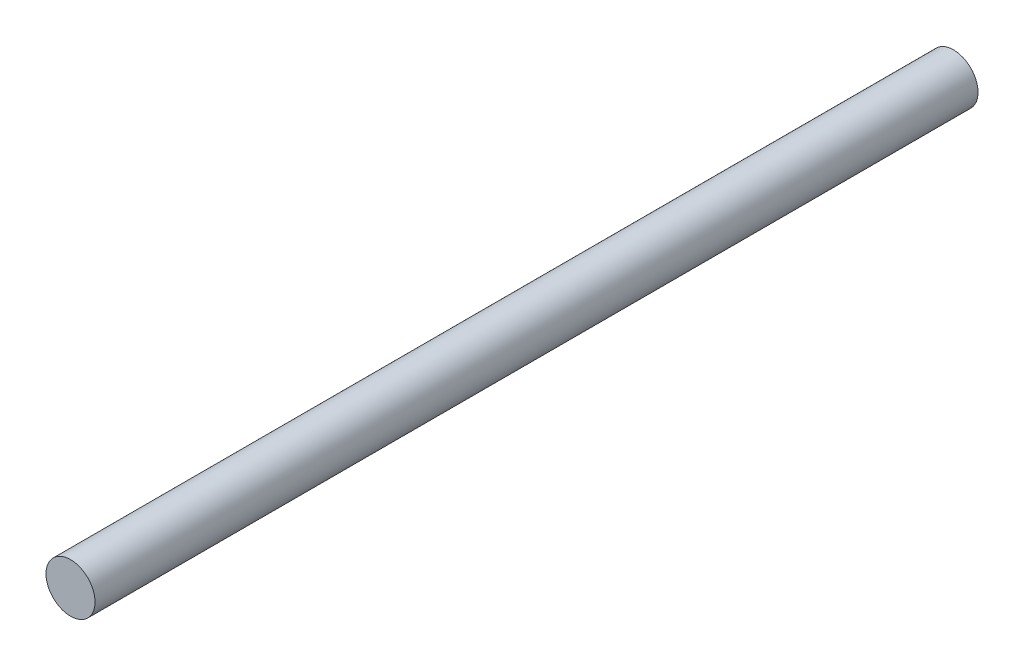
ISO-10303-21;
HEADER;
FILE_DESCRIPTION(('STEP AP214'),'2;1');
FILE_NAME('part.step','',(''),(''),'','','');
FILE_SCHEMA(('AUTOMOTIVE_DESIGN { 1 0 10303 214 1 1 1 1 }'));
ENDSEC;
DATA;
#1=APPLICATION_CONTEXT('core data for automotive mechanical design processes');
#2=APPLICATION_PROTOCOL_DEFINITION('international standard','automotive_design',2000,#1);
#3=PRODUCT_CONTEXT('',#1,'mechanical');
#4=PRODUCT('Part','Part','',(#3));
#5=PRODUCT_RELATED_PRODUCT_CATEGORY('part','',(#4));
#6=PRODUCT_DEFINITION_FORMATION('','',#4);
#7=PRODUCT_DEFINITION_CONTEXT('part definition',#1,'design');
#8=PRODUCT_DEFINITION('design','',#6,#7);
#9=PRODUCT_DEFINITION_SHAPE('','',#8);
#10=(LENGTH_UNIT() NAMED_UNIT(*) SI_UNIT(.MILLI.,.METRE.));
#11=(NAMED_UNIT(*) PLANE_ANGLE_UNIT() SI_UNIT($,.RADIAN.));
#12=(NAMED_UNIT(*) SI_UNIT($,.STERADIAN.) SOLID_ANGLE_UNIT());
#13=UNCERTAINTY_MEASURE_WITH_UNIT(LENGTH_MEASURE(1.E-05),#10,'distance_accuracy_value','');
#14=(GEOMETRIC_REPRESENTATION_CONTEXT(3) GLOBAL_UNCERTAINTY_ASSIGNED_CONTEXT((#13)) GLOBAL_UNIT_ASSIGNED_CONTEXT((#10,
#11,#12)) REPRESENTATION_CONTEXT('',''));
#15=CARTESIAN_POINT('',(0.,0.,0.));
#16=DIRECTION('',(0.,0.,1.));
#17=DIRECTION('',(1.,0.,0.));
#18=AXIS2_PLACEMENT_3D('',#15,#16,#17);
#19=CARTESIAN_POINT('',(0.,0.,180.));
#20=DIRECTION('',(0.,0.,-1.));
#21=DIRECTION('',(-1.,0.,0.));
#22=AXIS2_PLACEMENT_3D('',#19,#20,#21);
#23=CYLINDRICAL_SURFACE('',#22,5.);
#24=CARTESIAN_POINT('',(0.,0.,180.));
#25=DIRECTION('',(0.,0.,1.));
#26=DIRECTION('',(1.,0.,0.));
#27=AXIS2_PLACEMENT_3D('',#24,#25,#26);
#28=CIRCLE('',#27,5.);
#29=CARTESIAN_POINT('',(-5.,0.,180.));
#30=VERTEX_POINT('',#29);
#31=EDGE_CURVE('E12',#30,#30,#28,.T.);
#32=CARTESIAN_POINT('',(0.,0.,0.));
#33=DIRECTION('',(0.,0.,1.));
#34=DIRECTION('',(1.,0.,0.));
#35=AXIS2_PLACEMENT_3D('',#32,#33,#34);
#36=CIRCLE('',#35,5.);
#37=CARTESIAN_POINT('',(-5.,0.,0.));
#38=VERTEX_POINT('',#37);
#39=EDGE_CURVE('E43',#38,#38,#36,.T.);
#40=CARTESIAN_POINT('',(-5.,0.,180.));
#41=CARTESIAN_POINT('',(-5.,0.,178.125));
#42=CARTESIAN_POINT('',(-5.,0.,176.25));
#43=CARTESIAN_POINT('',(-5.,0.,172.5));
#44=CARTESIAN_POINT('',(-5.,0.,170.625));
#45=CARTESIAN_POINT('',(-5.,0.,166.875));
#46=CARTESIAN_POINT('',(-5.,0.,165.));
#47=CARTESIAN_POINT('',(-5.,0.,161.25));
#48=CARTESIAN_POINT('',(-5.,0.,159.375));
#49=CARTESIAN_POINT('',(-5.,0.,155.625));
#50=CARTESIAN_POINT('',(-5.,0.,153.75));
#51=CARTESIAN_POINT('',(-5.,0.,150.));
#52=CARTESIAN_POINT('',(-5.,0.,148.125));
#53=CARTESIAN_POINT('',(-5.,0.,144.375));
#54=CARTESIAN_POINT('',(-5.,0.,142.5));
#55=CARTESIAN_POINT('',(-5.,0.,138.75));
#56=CARTESIAN_POINT('',(-5.,0.,136.875));
#57=CARTESIAN_POINT('',(-5.,0.,133.125));
#58=CARTESIAN_POINT('',(-5.,0.,131.25));
#59=CARTESIAN_POINT('',(-5.,0.,127.5));
#60=CARTESIAN_POINT('',(-5.,0.,125.625));
#61=CARTESIAN_POINT('',(-5.,0.,121.875));
#62=CARTESIAN_POINT('',(-5.,0.,120.));
#63=CARTESIAN_POINT('',(-5.,0.,116.25));
#64=CARTESIAN_POINT('',(-5.,0.,114.375));
#65=CARTESIAN_POINT('',(-5.,0.,110.625));
#66=CARTESIAN_POINT('',(-5.,0.,108.75));
#67=CARTESIAN_POINT('',(-5.,0.,105.));
#68=CARTESIAN_POINT('',(-5.,0.,103.125));
#69=CARTESIAN_POINT('',(-5.,0.,99.375));
#70=CARTESIAN_POINT('',(-5.,0.,97.5));
#71=CARTESIAN_POINT('',(-5.,0.,93.75));
#72=CARTESIAN_POINT('',(-5.,0.,91.875));
#73=CARTESIAN_POINT('',(-5.,0.,88.125));
#74=CARTESIAN_POINT('',(-5.,0.,86.25));
#75=CARTESIAN_POINT('',(-5.,0.,82.5));
#76=CARTESIAN_POINT('',(-5.,0.,80.625));
#77=CARTESIAN_POINT('',(-5.,0.,76.875));
#78=CARTESIAN_POINT('',(-5.,0.,75.));
#79=CARTESIAN_POINT('',(-5.,0.,71.25));
#80=CARTESIAN_POINT('',(-5.,0.,69.375));
#81=CARTESIAN_POINT('',(-5.,0.,65.625));
#82=CARTESIAN_POINT('',(-5.,0.,63.75));
#83=CARTESIAN_POINT('',(-5.,0.,60.));
#84=CARTESIAN_POINT('',(-5.,0.,58.125));
#85=CARTESIAN_POINT('',(-5.,0.,54.375));
#86=CARTESIAN_POINT('',(-5.,0.,52.5));
#87=CARTESIAN_POINT('',(-5.,0.,48.75));
#88=CARTESIAN_POINT('',(-5.,0.,46.875));
#89=CARTESIAN_POINT('',(-5.,0.,43.125));
#90=CARTESIAN_POINT('',(-5.,0.,41.25));
#91=CARTESIAN_POINT('',(-5.,0.,37.5));
#92=CARTESIAN_POINT('',(-5.,0.,35.625));
#93=CARTESIAN_POINT('',(-5.,0.,31.875));
#94=CARTESIAN_POINT('',(-5.,0.,30.));
#95=CARTESIAN_POINT('',(-5.,0.,26.25));
#96=CARTESIAN_POINT('',(-5.,0.,24.375));
#97=CARTESIAN_POINT('',(-5.,0.,20.625));
#98=CARTESIAN_POINT('',(-5.,0.,18.75));
#99=CARTESIAN_POINT('',(-5.,0.,15.));
#100=CARTESIAN_POINT('',(-5.,0.,13.125));
#101=CARTESIAN_POINT('',(-5.,0.,9.375));
#102=CARTESIAN_POINT('',(-5.,0.,7.5));
#103=CARTESIAN_POINT('',(-5.,0.,3.74999999999999));
#104=CARTESIAN_POINT('',(-5.,0.,1.875));
#105=CARTESIAN_POINT('',(-5.,0.,0.));
#106=B_SPLINE_CURVE_WITH_KNOTS('',3,(#40,#41,#42,#43,#44,#45,#46,#47,#48,#49,#50,#51,#52,#53,
#54,#55,#56,#57,#58,#59,#60,#61,#62,#63,#64,#65,#66,#67,#68,#69,#70,#71,#72,#73,#74,#75,#76,#77,
#78,#79,#80,#81,#82,#83,#84,#85,#86,#87,#88,#89,#90,#91,#92,#93,#94,#95,#96,#97,#98,#99,#100,
#101,#102,#103,#104,#105),.UNSPECIFIED.,.F.,.F.,(4,2,2,2,2,2,2,2,2,2,2,2,2,2,2,2,2,2,2,2,2,2,2,
2,2,2,2,2,2,2,2,2,4),(0.,5.62499999999999,11.25,16.875,22.5,28.125,33.75,39.375,45.,50.625,
56.25,61.875,67.5,73.125,78.75,84.375,90.,95.625,101.25,106.875,112.5,118.125,123.75,129.375,
135.,140.625,146.25,151.875,157.5,163.125,168.75,174.375,180.),.UNSPECIFIED.);
#107=EDGE_CURVE('BSEAM40',#30,#38,#106,.T.);
#108=ORIENTED_EDGE('',*,*,#31,.F.);
#109=ORIENTED_EDGE('',*,*,#39,.T.);
#110=ORIENTED_EDGE('',*,*,#107,.T.);
#111=ORIENTED_EDGE('',*,*,#107,.F.);
#112=EDGE_LOOP('',(#108,#110,#109,#111));
#113=FACE_BOUND('',#112,.T.);
#114=ADVANCED_FACE('F40',(#113),#23,.T.);
#115=CARTESIAN_POINT('',(0.,0.,180.));
#116=DIRECTION('',(0.,0.,1.));
#117=DIRECTION('',(1.,0.,0.));
#118=AXIS2_PLACEMENT_3D('',#115,#116,#117);
#119=PLANE('',#118);
#120=ORIENTED_EDGE('',*,*,#31,.T.);
#121=EDGE_LOOP('',(#120));
#122=FACE_BOUND('',#121,.T.);
#123=ADVANCED_FACE('F55',(#122),#119,.T.);
#124=CARTESIAN_POINT('',(0.,0.,0.));
#125=DIRECTION('',(0.,0.,1.));
#126=DIRECTION('',(1.,0.,0.));
#127=AXIS2_PLACEMENT_3D('',#124,#125,#126);
#128=PLANE('',#127);
#129=ORIENTED_EDGE('',*,*,#39,.F.);
#130=EDGE_LOOP('',(#129));
#131=FACE_BOUND('',#130,.T.);
#132=ADVANCED_FACE('F53',(#131),#128,.F.);
#133=CLOSED_SHELL('',(#114,#123,#132));
#134=MANIFOLD_SOLID_BREP('B2',#133);
#135=ADVANCED_BREP_SHAPE_REPRESENTATION('',(#18,#134),#14);
#136=SHAPE_DEFINITION_REPRESENTATION(#9,#135);
ENDSEC;
END-ISO-10303-21;
